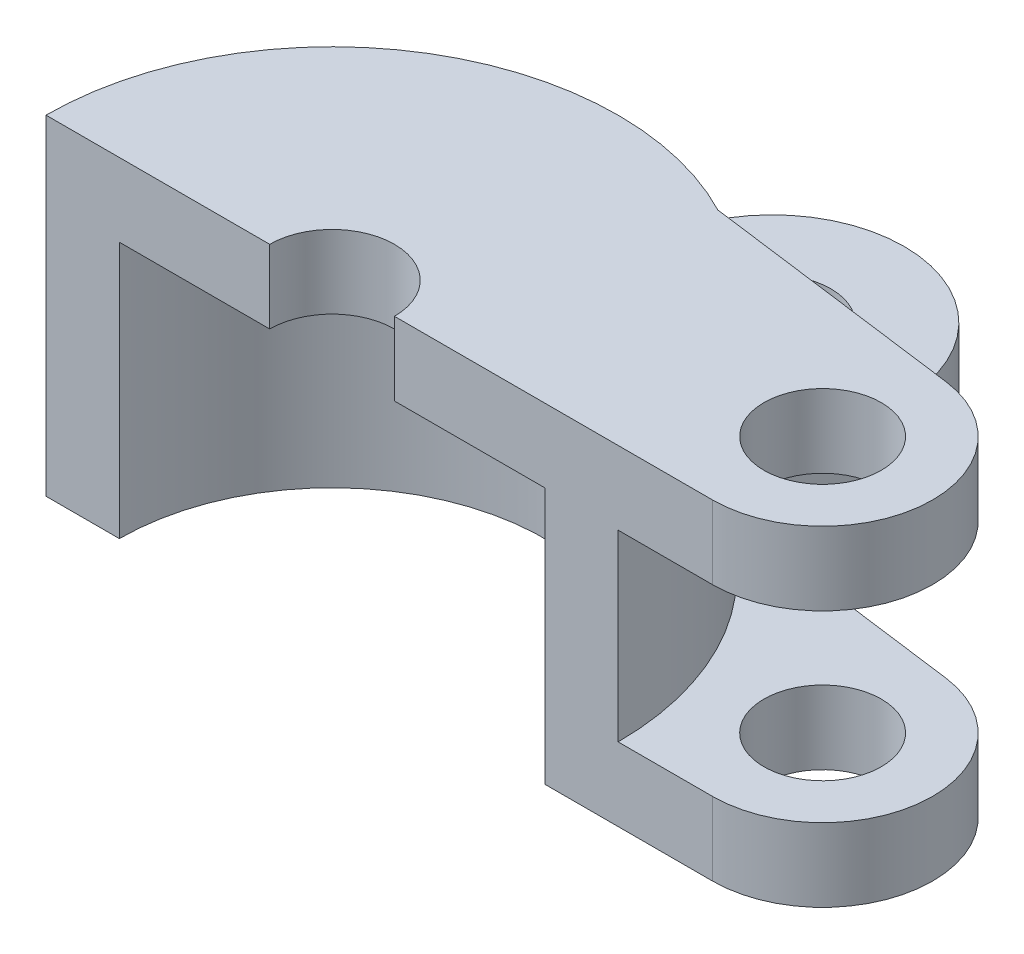
ISO-10303-21;
HEADER;
FILE_DESCRIPTION(('STEP AP214'),'2;1');
FILE_NAME('part.step','',(''),(''),'','','');
FILE_SCHEMA(('AUTOMOTIVE_DESIGN { 1 0 10303 214 1 1 1 1 }'));
ENDSEC;
DATA;
#1=APPLICATION_CONTEXT('core data for automotive mechanical design processes');
#2=APPLICATION_PROTOCOL_DEFINITION('international standard','automotive_design',2000,#1);
#3=PRODUCT_CONTEXT('',#1,'mechanical');
#4=PRODUCT('Part','Part','',(#3));
#5=PRODUCT_RELATED_PRODUCT_CATEGORY('part','',(#4));
#6=PRODUCT_DEFINITION_FORMATION('','',#4);
#7=PRODUCT_DEFINITION_CONTEXT('part definition',#1,'design');
#8=PRODUCT_DEFINITION('design','',#6,#7);
#9=PRODUCT_DEFINITION_SHAPE('','',#8);
#10=(LENGTH_UNIT() NAMED_UNIT(*) SI_UNIT(.MILLI.,.METRE.));
#11=(NAMED_UNIT(*) PLANE_ANGLE_UNIT() SI_UNIT($,.RADIAN.));
#12=(NAMED_UNIT(*) SI_UNIT($,.STERADIAN.) SOLID_ANGLE_UNIT());
#13=UNCERTAINTY_MEASURE_WITH_UNIT(LENGTH_MEASURE(1.E-05),#10,'distance_accuracy_value','');
#14=(GEOMETRIC_REPRESENTATION_CONTEXT(3) GLOBAL_UNCERTAINTY_ASSIGNED_CONTEXT((#13)) GLOBAL_UNIT_ASSIGNED_CONTEXT((#10,
#11,#12)) REPRESENTATION_CONTEXT('',''));
#15=CARTESIAN_POINT('',(0.,0.,0.));
#16=DIRECTION('',(0.,0.,1.));
#17=DIRECTION('',(1.,0.,0.));
#18=AXIS2_PLACEMENT_3D('',#15,#16,#17);
#19=CARTESIAN_POINT('',(10.3749698794743,20.9762279597806,-3.));
#20=DIRECTION('',(0.,-1.,0.));
#21=DIRECTION('',(0.,0.,-1.));
#22=AXIS2_PLACEMENT_3D('',#19,#20,#21);
#23=CYLINDRICAL_SURFACE('',#22,3.);
#24=DIRECTION('',(0.,-1.,0.));
#25=VECTOR('',#24,1.);
#26=CARTESIAN_POINT('',(10.3749698794743,20.9762279597806,0.));
#27=LINE('',#26,#25);
#28=CARTESIAN_POINT('',(10.3749698794743,9.,0.));
#29=VERTEX_POINT('',#28);
#30=CARTESIAN_POINT('',(10.3749698794743,7.,0.));
#31=VERTEX_POINT('',#30);
#32=EDGE_CURVE('E209',#29,#31,#27,.T.);
#33=ORIENTED_EDGE('',*,*,#32,.T.);
#34=CARTESIAN_POINT('',(10.3749698794743,7.,-3.));
#35=DIRECTION('',(0.,-1.,0.));
#36=DIRECTION('',(0.,0.,-1.));
#37=AXIS2_PLACEMENT_3D('',#34,#35,#36);
#38=CIRCLE('',#37,3.);
#39=CARTESIAN_POINT('',(10.7672455799969,7.,-5.97424272290941));
#40=VERTEX_POINT('',#39);
#41=EDGE_CURVE('E191',#40,#31,#38,.T.);
#42=ORIENTED_EDGE('',*,*,#41,.F.);
#43=DIRECTION('',(0.,-1.,0.));
#44=VECTOR('',#43,1.);
#45=CARTESIAN_POINT('',(10.7672455799969,20.9762279597806,-5.97424272290941));
#46=LINE('',#45,#44);
#47=CARTESIAN_POINT('',(10.7672455799969,9.,-5.97424272290941));
#48=VERTEX_POINT('',#47);
#49=EDGE_CURVE('E224',#48,#40,#46,.T.);
#50=ORIENTED_EDGE('',*,*,#49,.F.);
#51=CARTESIAN_POINT('',(10.3749698794743,9.,-3.));
#52=DIRECTION('',(0.,1.,0.));
#53=DIRECTION('',(0.,0.,1.));
#54=AXIS2_PLACEMENT_3D('',#51,#52,#53);
#55=CIRCLE('',#54,3.);
#56=EDGE_CURVE('E215',#48,#29,#55,.F.);
#57=ORIENTED_EDGE('',*,*,#56,.T.);
#58=EDGE_LOOP('',(#33,#42,#50,#57));
#59=FACE_BOUND('',#58,.T.);
#60=ADVANCED_FACE('F45',(#59),#23,.T.);
#61=CARTESIAN_POINT('',(3.6,20.9762279597806,-6.91953755680248));
#62=DIRECTION('',(0.130758566840845,0.,-0.991414240969802));
#63=DIRECTION('',(-0.991414240969802,0.,-0.130758566840845));
#64=AXIS2_PLACEMENT_3D('',#61,#62,#63);
#65=PLANE('',#64);
#66=ORIENTED_EDGE('',*,*,#49,.T.);
#67=DIRECTION('',(0.991414240969802,0.,0.130758566840845));
#68=VECTOR('',#67,1.);
#69=CARTESIAN_POINT('',(3.6,7.,-6.91953755680248));
#70=LINE('',#69,#68);
#71=CARTESIAN_POINT('',(3.6,6.99999999999983,-6.91953755680248));
#72=VERTEX_POINT('',#71);
#73=EDGE_CURVE('E198',#72,#40,#70,.T.);
#74=ORIENTED_EDGE('',*,*,#73,.F.);
#75=DIRECTION('',(0.,-1.,0.));
#76=VECTOR('',#75,1.);
#77=CARTESIAN_POINT('',(3.6,20.9762279597806,-6.91953755680248));
#78=LINE('',#77,#76);
#79=CARTESIAN_POINT('',(3.6,9.,-6.91953755680248));
#80=VERTEX_POINT('',#79);
#81=EDGE_CURVE('E227',#80,#72,#78,.T.);
#82=ORIENTED_EDGE('',*,*,#81,.F.);
#83=DIRECTION('',(0.991414240969802,0.,0.130758566840845));
#84=VECTOR('',#83,1.);
#85=CARTESIAN_POINT('',(3.6,9.,-6.91953755680248));
#86=LINE('',#85,#84);
#87=EDGE_CURVE('E216',#80,#48,#86,.T.);
#88=ORIENTED_EDGE('',*,*,#87,.T.);
#89=EDGE_LOOP('',(#66,#74,#82,#88));
#90=FACE_BOUND('',#89,.T.);
#91=ADVANCED_FACE('F404',(#90),#65,.T.);
#92=CARTESIAN_POINT('',(10.3749698794743,20.9762279597806,-3.));
#93=DIRECTION('',(0.,-1.,0.));
#94=DIRECTION('',(0.,0.,-1.));
#95=AXIS2_PLACEMENT_3D('',#92,#93,#94);
#96=CYLINDRICAL_SURFACE('',#95,1.6);
#97=CARTESIAN_POINT('',(10.3749698794743,9.,-3.));
#98=DIRECTION('',(0.,1.,0.));
#99=DIRECTION('',(0.,0.,1.));
#100=AXIS2_PLACEMENT_3D('',#97,#98,#99);
#101=CIRCLE('',#100,1.6);
#102=CARTESIAN_POINT('',(10.3749698794743,9.,-1.4));
#103=VERTEX_POINT('',#102);
#104=EDGE_CURVE('E234',#103,#103,#101,.F.);
#105=ORIENTED_EDGE('',*,*,#104,.F.);
#106=EDGE_LOOP('',(#105));
#107=FACE_BOUND('',#106,.T.);
#108=CARTESIAN_POINT('',(10.3749698794743,7.,-3.));
#109=DIRECTION('',(0.,-1.,0.));
#110=DIRECTION('',(0.,0.,-1.));
#111=AXIS2_PLACEMENT_3D('',#108,#109,#110);
#112=CIRCLE('',#111,1.6);
#113=CARTESIAN_POINT('',(10.3749698794743,7.,-4.6));
#114=VERTEX_POINT('',#113);
#115=EDGE_CURVE('E497',#114,#114,#112,.F.);
#116=ORIENTED_EDGE('',*,*,#115,.F.);
#117=EDGE_LOOP('',(#116));
#118=FACE_BOUND('',#117,.T.);
#119=ADVANCED_FACE('F396',(#107,#118),#96,.F.);
#120=CARTESIAN_POINT('',(0.,7.,0.));
#121=DIRECTION('',(0.,-1.,0.));
#122=DIRECTION('',(0.,0.,-1.));
#123=AXIS2_PLACEMENT_3D('',#120,#121,#122);
#124=CYLINDRICAL_SURFACE('',#123,7.8);
#125=CARTESIAN_POINT('',(0.,9.,0.));
#126=DIRECTION('',(0.,1.,0.));
#127=DIRECTION('',(0.,0.,1.));
#128=AXIS2_PLACEMENT_3D('',#125,#126,#127);
#129=CIRCLE('',#128,7.8);
#130=CARTESIAN_POINT('',(-7.8,9.,0.));
#131=VERTEX_POINT('',#130);
#132=EDGE_CURVE('E262',#80,#131,#129,.T.);
#133=ORIENTED_EDGE('',*,*,#132,.F.);
#134=ORIENTED_EDGE('',*,*,#81,.T.);
#135=CARTESIAN_POINT('',(0.,7.,0.));
#136=DIRECTION('',(0.,-1.,0.));
#137=DIRECTION('',(0.,0.,-1.));
#138=AXIS2_PLACEMENT_3D('',#135,#136,#137);
#139=CIRCLE('',#138,7.8);
#140=CARTESIAN_POINT('',(-3.6,7.,-6.91953755680248));
#141=VERTEX_POINT('',#140);
#142=EDGE_CURVE('E310',#72,#141,#139,.F.);
#143=ORIENTED_EDGE('',*,*,#142,.T.);
#144=DIRECTION('',(0.,-1.,0.));
#145=VECTOR('',#144,1.);
#146=CARTESIAN_POINT('',(-3.6,2.,-6.91953755680248));
#147=LINE('',#146,#145);
#148=CARTESIAN_POINT('',(-3.6,0.,-6.91953755680248));
#149=VERTEX_POINT('',#148);
#150=EDGE_CURVE('E253',#141,#149,#147,.T.);
#151=ORIENTED_EDGE('',*,*,#150,.T.);
#152=CARTESIAN_POINT('',(0.,0.,0.));
#153=DIRECTION('',(0.,1.,0.));
#154=DIRECTION('',(0.,0.,1.));
#155=AXIS2_PLACEMENT_3D('',#152,#153,#154);
#156=CIRCLE('',#155,7.8);
#157=CARTESIAN_POINT('',(-7.8,0.,0.));
#158=VERTEX_POINT('',#157);
#159=EDGE_CURVE('E282',#149,#158,#156,.T.);
#160=ORIENTED_EDGE('',*,*,#159,.T.);
#161=DIRECTION('',(0.,-1.,0.));
#162=VECTOR('',#161,1.);
#163=CARTESIAN_POINT('',(-7.8,7.,0.));
#164=LINE('',#163,#162);
#165=EDGE_CURVE('E302',#131,#158,#164,.T.);
#166=ORIENTED_EDGE('',*,*,#165,.F.);
#167=EDGE_LOOP('',(#133,#134,#143,#151,#160,#166));
#168=FACE_BOUND('',#167,.T.);
#169=ADVANCED_FACE('F339',(#168),#124,.T.);
#170=CARTESIAN_POINT('',(-7.8,7.,0.));
#171=DIRECTION('',(0.,0.,-1.));
#172=DIRECTION('',(-1.,0.,0.));
#173=AXIS2_PLACEMENT_3D('',#170,#171,#172);
#174=PLANE('',#173);
#175=DIRECTION('',(1.,0.,0.));
#176=VECTOR('',#175,1.);
#177=CARTESIAN_POINT('',(-7.8,0.,0.));
#178=LINE('',#177,#176);
#179=CARTESIAN_POINT('',(-5.8,0.,0.));
#180=VERTEX_POINT('',#179);
#181=EDGE_CURVE('E291',#158,#180,#178,.T.);
#182=ORIENTED_EDGE('',*,*,#181,.T.);
#183=DIRECTION('',(0.,-1.,0.));
#184=VECTOR('',#183,1.);
#185=CARTESIAN_POINT('',(-5.8,7.,0.));
#186=LINE('',#185,#184);
#187=CARTESIAN_POINT('',(-5.8,7.,0.));
#188=VERTEX_POINT('',#187);
#189=EDGE_CURVE('E299',#188,#180,#186,.T.);
#190=ORIENTED_EDGE('',*,*,#189,.F.);
#191=DIRECTION('',(1.,0.,0.));
#192=VECTOR('',#191,1.);
#193=CARTESIAN_POINT('',(-7.8,7.,0.));
#194=LINE('',#193,#192);
#195=CARTESIAN_POINT('',(-1.7,7.,0.));
#196=VERTEX_POINT('',#195);
#197=EDGE_CURVE('E256',#188,#196,#194,.T.);
#198=ORIENTED_EDGE('',*,*,#197,.T.);
#199=DIRECTION('',(0.,-1.,0.));
#200=VECTOR('',#199,1.);
#201=CARTESIAN_POINT('',(-1.7,9.,0.));
#202=LINE('',#201,#200);
#203=CARTESIAN_POINT('',(-1.7,9.,0.));
#204=VERTEX_POINT('',#203);
#205=EDGE_CURVE('E279',#204,#196,#202,.T.);
#206=ORIENTED_EDGE('',*,*,#205,.F.);
#207=DIRECTION('',(1.,0.,0.));
#208=VECTOR('',#207,1.);
#209=CARTESIAN_POINT('',(-7.8,9.,0.));
#210=LINE('',#209,#208);
#211=EDGE_CURVE('E264',#131,#204,#210,.T.);
#212=ORIENTED_EDGE('',*,*,#211,.F.);
#213=ORIENTED_EDGE('',*,*,#165,.T.);
#214=EDGE_LOOP('',(#182,#190,#198,#206,#212,#213));
#215=FACE_BOUND('',#214,.T.);
#216=ADVANCED_FACE('F476',(#215),#174,.F.);
#217=CARTESIAN_POINT('',(0.,7.,0.));
#218=DIRECTION('',(0.,-1.,0.));
#219=DIRECTION('',(0.,0.,-1.));
#220=AXIS2_PLACEMENT_3D('',#217,#218,#219);
#221=CYLINDRICAL_SURFACE('',#220,5.8);
#222=CARTESIAN_POINT('',(0.,0.,0.));
#223=DIRECTION('',(0.,-1.,0.));
#224=DIRECTION('',(0.,0.,1.));
#225=AXIS2_PLACEMENT_3D('',#222,#223,#224);
#226=CIRCLE('',#225,5.8);
#227=CARTESIAN_POINT('',(5.8,0.,0.));
#228=VERTEX_POINT('',#227);
#229=EDGE_CURVE('E293',#180,#228,#226,.T.);
#230=ORIENTED_EDGE('',*,*,#229,.T.);
#231=DIRECTION('',(0.,-1.,0.));
#232=VECTOR('',#231,1.);
#233=CARTESIAN_POINT('',(5.8,7.,0.));
#234=LINE('',#233,#232);
#235=CARTESIAN_POINT('',(5.8,7.,0.));
#236=VERTEX_POINT('',#235);
#237=EDGE_CURVE('E286',#236,#228,#234,.T.);
#238=ORIENTED_EDGE('',*,*,#237,.F.);
#239=CARTESIAN_POINT('',(0.,7.,0.));
#240=DIRECTION('',(0.,-1.,0.));
#241=DIRECTION('',(0.,0.,1.));
#242=AXIS2_PLACEMENT_3D('',#239,#240,#241);
#243=CIRCLE('',#242,5.8);
#244=EDGE_CURVE('E283',#188,#236,#243,.T.);
#245=ORIENTED_EDGE('',*,*,#244,.F.);
#246=ORIENTED_EDGE('',*,*,#189,.T.);
#247=EDGE_LOOP('',(#230,#238,#245,#246));
#248=FACE_BOUND('',#247,.T.);
#249=ADVANCED_FACE('F440',(#248),#221,.F.);
#250=CARTESIAN_POINT('',(5.8,7.,0.));
#251=DIRECTION('',(0.,0.,-1.));
#252=DIRECTION('',(-1.,0.,0.));
#253=AXIS2_PLACEMENT_3D('',#250,#251,#252);
#254=PLANE('',#253);
#255=CARTESIAN_POINT('',(10.3749698794743,2.,0.));
#256=VERTEX_POINT('',#255);
#257=CARTESIAN_POINT('',(10.3749698794743,0.,0.));
#258=VERTEX_POINT('',#257);
#259=EDGE_CURVE('E217',#256,#258,#27,.T.);
#260=ORIENTED_EDGE('',*,*,#259,.F.);
#261=DIRECTION('',(-1.,0.,0.));
#262=VECTOR('',#261,1.);
#263=CARTESIAN_POINT('',(10.3749698794743,2.,0.));
#264=LINE('',#263,#262);
#265=CARTESIAN_POINT('',(7.8,2.,0.));
#266=VERTEX_POINT('',#265);
#267=EDGE_CURVE('E505',#256,#266,#264,.T.);
#268=ORIENTED_EDGE('',*,*,#267,.T.);
#269=DIRECTION('',(0.,1.,0.));
#270=VECTOR('',#269,1.);
#271=CARTESIAN_POINT('',(7.8,2.,0.));
#272=LINE('',#271,#270);
#273=CARTESIAN_POINT('',(7.8,7.,0.));
#274=VERTEX_POINT('',#273);
#275=EDGE_CURVE('E212',#266,#274,#272,.T.);
#276=ORIENTED_EDGE('',*,*,#275,.T.);
#277=DIRECTION('',(-1.,0.,0.));
#278=VECTOR('',#277,1.);
#279=CARTESIAN_POINT('',(10.3749698794743,7.,0.));
#280=LINE('',#279,#278);
#281=EDGE_CURVE('E195',#31,#274,#280,.T.);
#282=ORIENTED_EDGE('',*,*,#281,.F.);
#283=ORIENTED_EDGE('',*,*,#32,.F.);
#284=DIRECTION('',(1.,0.,0.));
#285=VECTOR('',#284,1.);
#286=CARTESIAN_POINT('',(7.8,9.,0.));
#287=LINE('',#286,#285);
#288=CARTESIAN_POINT('',(1.7,9.,0.));
#289=VERTEX_POINT('',#288);
#290=EDGE_CURVE('E269',#289,#29,#287,.T.);
#291=ORIENTED_EDGE('',*,*,#290,.F.);
#292=DIRECTION('',(0.,-1.,0.));
#293=VECTOR('',#292,1.);
#294=CARTESIAN_POINT('',(1.7,9.,0.));
#295=LINE('',#294,#293);
#296=CARTESIAN_POINT('',(1.7,7.,0.));
#297=VERTEX_POINT('',#296);
#298=EDGE_CURVE('E271',#289,#297,#295,.T.);
#299=ORIENTED_EDGE('',*,*,#298,.T.);
#300=DIRECTION('',(1.,0.,0.));
#301=VECTOR('',#300,1.);
#302=CARTESIAN_POINT('',(7.8,7.,0.));
#303=LINE('',#302,#301);
#304=EDGE_CURVE('E265',#297,#236,#303,.T.);
#305=ORIENTED_EDGE('',*,*,#304,.T.);
#306=ORIENTED_EDGE('',*,*,#237,.T.);
#307=DIRECTION('',(1.,0.,0.));
#308=VECTOR('',#307,1.);
#309=CARTESIAN_POINT('',(5.8,0.,0.));
#310=LINE('',#309,#308);
#311=EDGE_CURVE('E287',#228,#258,#310,.T.);
#312=ORIENTED_EDGE('',*,*,#311,.T.);
#313=EDGE_LOOP('',(#260,#268,#276,#282,#283,#291,#299,#305,#306,#312));
#314=FACE_BOUND('',#313,.T.);
#315=ADVANCED_FACE('F207',(#314),#254,.F.);
#316=CARTESIAN_POINT('',(0.,0.,0.));
#317=DIRECTION('',(0.,1.,0.));
#318=DIRECTION('',(0.,0.,1.));
#319=AXIS2_PLACEMENT_3D('',#316,#317,#318);
#320=PLANE('',#319);
#321=DIRECTION('',(0.,0.,-1.));
#322=VECTOR('',#321,1.);
#323=CARTESIAN_POINT('',(3.6,0.,0.));
#324=LINE('',#323,#322);
#325=CARTESIAN_POINT('',(3.6,0.,-6.91953755680248));
#326=VERTEX_POINT('',#325);
#327=CARTESIAN_POINT('',(3.6,0.,-10.7833204533669));
#328=VERTEX_POINT('',#327);
#329=EDGE_CURVE('E522',#326,#328,#324,.T.);
#330=ORIENTED_EDGE('',*,*,#329,.F.);
#331=DIRECTION('',(0.991414240969802,0.,0.130758566840845));
#332=VECTOR('',#331,1.);
#333=CARTESIAN_POINT('',(3.6,0.,-6.91953755680248));
#334=LINE('',#333,#332);
#335=CARTESIAN_POINT('',(10.7672455799969,0.,-5.97424272290941));
#336=VERTEX_POINT('',#335);
#337=EDGE_CURVE('E451',#326,#336,#334,.T.);
#338=ORIENTED_EDGE('',*,*,#337,.T.);
#339=CARTESIAN_POINT('',(10.3749698794743,0.,-3.));
#340=DIRECTION('',(0.,-1.,0.));
#341=DIRECTION('',(0.,0.,-1.));
#342=AXIS2_PLACEMENT_3D('',#339,#340,#341);
#343=CIRCLE('',#342,3.);
#344=EDGE_CURVE('E450',#336,#258,#343,.T.);
#345=ORIENTED_EDGE('',*,*,#344,.T.);
#346=ORIENTED_EDGE('',*,*,#311,.F.);
#347=ORIENTED_EDGE('',*,*,#229,.F.);
#348=ORIENTED_EDGE('',*,*,#181,.F.);
#349=ORIENTED_EDGE('',*,*,#159,.F.);
#350=DIRECTION('',(0.,0.,1.));
#351=VECTOR('',#350,1.);
#352=CARTESIAN_POINT('',(-3.6,0.,0.));
#353=LINE('',#352,#351);
#354=CARTESIAN_POINT('',(-3.6,0.,-10.7833204533669));
#355=VERTEX_POINT('',#354);
#356=EDGE_CURVE('E69',#355,#149,#353,.T.);
#357=ORIENTED_EDGE('',*,*,#356,.F.);
#358=CARTESIAN_POINT('',(-0.600000000000001,0.,-10.7833204533669));
#359=DIRECTION('',(0.,1.,0.));
#360=DIRECTION('',(0.,0.,1.));
#361=AXIS2_PLACEMENT_3D('',#358,#359,#360);
#362=CIRCLE('',#361,3.);
#363=CARTESIAN_POINT('',(-0.433333333333334,0.,-7.78795366076495));
#364=VERTEX_POINT('',#363);
#365=EDGE_CURVE('E11',#355,#364,#362,.T.);
#366=ORIENTED_EDGE('',*,*,#365,.T.);
#367=CARTESIAN_POINT('',(0.433333333333334,0.,-7.78795366076495));
#368=VERTEX_POINT('',#367);
#369=EDGE_CURVE('E288',#368,#364,#156,.T.);
#370=ORIENTED_EDGE('',*,*,#369,.F.);
#371=CARTESIAN_POINT('',(0.600000000000001,0.,-10.7833204533669));
#372=DIRECTION('',(0.,1.,0.));
#373=DIRECTION('',(0.,0.,1.));
#374=AXIS2_PLACEMENT_3D('',#371,#372,#373);
#375=CIRCLE('',#374,3.);
#376=EDGE_CURVE('E54',#368,#328,#375,.T.);
#377=ORIENTED_EDGE('',*,*,#376,.T.);
#378=EDGE_LOOP('',(#330,#338,#345,#346,#347,#348,#349,#357,#366,#370,#377));
#379=FACE_BOUND('',#378,.T.);
#380=CARTESIAN_POINT('',(10.3749698794743,0.,-3.));
#381=DIRECTION('',(0.,-1.,0.));
#382=DIRECTION('',(0.,0.,-1.));
#383=AXIS2_PLACEMENT_3D('',#380,#381,#382);
#384=CIRCLE('',#383,1.6);
#385=CARTESIAN_POINT('',(10.3749698794743,0.,-4.6));
#386=VERTEX_POINT('',#385);
#387=EDGE_CURVE('E226',#386,#386,#384,.T.);
#388=ORIENTED_EDGE('',*,*,#387,.F.);
#389=EDGE_LOOP('',(#388));
#390=FACE_BOUND('',#389,.T.);
#391=ADVANCED_FACE('F445',(#379,#390),#320,.F.);
#392=CARTESIAN_POINT('',(0.,7.,0.));
#393=DIRECTION('',(0.,1.,0.));
#394=DIRECTION('',(0.,0.,1.));
#395=AXIS2_PLACEMENT_3D('',#392,#393,#394);
#396=PLANE('',#395);
#397=ORIENTED_EDGE('',*,*,#197,.F.);
#398=ORIENTED_EDGE('',*,*,#244,.T.);
#399=ORIENTED_EDGE('',*,*,#304,.F.);
#400=CARTESIAN_POINT('',(0.,7.,0.));
#401=DIRECTION('',(0.,-1.,0.));
#402=DIRECTION('',(0.,0.,1.));
#403=AXIS2_PLACEMENT_3D('',#400,#401,#402);
#404=CIRCLE('',#403,1.7);
#405=EDGE_CURVE('E273',#196,#297,#404,.T.);
#406=ORIENTED_EDGE('',*,*,#405,.F.);
#407=EDGE_LOOP('',(#397,#398,#399,#406));
#408=FACE_BOUND('',#407,.T.);
#409=ADVANCED_FACE('F437',(#408),#396,.F.);
#410=CARTESIAN_POINT('',(0.,9.,0.));
#411=DIRECTION('',(0.,-1.,0.));
#412=DIRECTION('',(0.,0.,-1.));
#413=AXIS2_PLACEMENT_3D('',#410,#411,#412);
#414=CYLINDRICAL_SURFACE('',#413,1.7);
#415=ORIENTED_EDGE('',*,*,#405,.T.);
#416=ORIENTED_EDGE('',*,*,#298,.F.);
#417=CARTESIAN_POINT('',(0.,9.,0.));
#418=DIRECTION('',(0.,-1.,0.));
#419=DIRECTION('',(0.,0.,1.));
#420=AXIS2_PLACEMENT_3D('',#417,#418,#419);
#421=CIRCLE('',#420,1.7);
#422=EDGE_CURVE('E267',#204,#289,#421,.T.);
#423=ORIENTED_EDGE('',*,*,#422,.F.);
#424=ORIENTED_EDGE('',*,*,#205,.T.);
#425=EDGE_LOOP('',(#415,#416,#423,#424));
#426=FACE_BOUND('',#425,.T.);
#427=ADVANCED_FACE('F469',(#426),#414,.F.);
#428=CARTESIAN_POINT('',(0.,9.,0.));
#429=DIRECTION('',(0.,1.,0.));
#430=DIRECTION('',(0.,0.,1.));
#431=AXIS2_PLACEMENT_3D('',#428,#429,#430);
#432=PLANE('',#431);
#433=ORIENTED_EDGE('',*,*,#290,.T.);
#434=ORIENTED_EDGE('',*,*,#56,.F.);
#435=ORIENTED_EDGE('',*,*,#87,.F.);
#436=ORIENTED_EDGE('',*,*,#132,.T.);
#437=ORIENTED_EDGE('',*,*,#211,.T.);
#438=ORIENTED_EDGE('',*,*,#422,.T.);
#439=EDGE_LOOP('',(#433,#434,#435,#436,#437,#438));
#440=FACE_BOUND('',#439,.T.);
#441=ORIENTED_EDGE('',*,*,#104,.T.);
#442=EDGE_LOOP('',(#441));
#443=FACE_BOUND('',#442,.T.);
#444=ADVANCED_FACE('F382',(#440,#443),#432,.T.);
#445=CARTESIAN_POINT('',(0.,2.,0.));
#446=DIRECTION('',(0.,-1.,0.));
#447=DIRECTION('',(0.,0.,-1.));
#448=AXIS2_PLACEMENT_3D('',#445,#446,#447);
#449=CYLINDRICAL_SURFACE('',#448,7.8);
#450=CARTESIAN_POINT('',(0.,-1.5,0.));
#451=DIRECTION('',(0.,-1.,0.));
#452=DIRECTION('',(0.,0.,-1.));
#453=AXIS2_PLACEMENT_3D('',#450,#451,#452);
#454=CIRCLE('',#453,7.8);
#455=CARTESIAN_POINT('',(-0.433333333333334,-1.5,-7.78795366076495));
#456=VERTEX_POINT('',#455);
#457=CARTESIAN_POINT('',(0.433333333333334,-1.5,-7.78795366076495));
#458=VERTEX_POINT('',#457);
#459=EDGE_CURVE('E243',#456,#458,#454,.T.);
#460=ORIENTED_EDGE('',*,*,#459,.T.);
#461=DIRECTION('',(0.,-1.,0.));
#462=VECTOR('',#461,1.);
#463=CARTESIAN_POINT('',(0.433333333333334,2.,-7.78795366076495));
#464=LINE('',#463,#462);
#465=EDGE_CURVE('E490',#458,#368,#464,.F.);
#466=ORIENTED_EDGE('',*,*,#465,.T.);
#467=ORIENTED_EDGE('',*,*,#369,.T.);
#468=DIRECTION('',(0.,-1.,0.));
#469=VECTOR('',#468,1.);
#470=CARTESIAN_POINT('',(-0.433333333333334,2.,-7.78795366076495));
#471=LINE('',#470,#469);
#472=EDGE_CURVE('E493',#364,#456,#471,.T.);
#473=ORIENTED_EDGE('',*,*,#472,.T.);
#474=EDGE_LOOP('',(#460,#466,#467,#473));
#475=FACE_BOUND('',#474,.T.);
#476=ADVANCED_FACE('F369',(#475),#449,.F.);
#477=CARTESIAN_POINT('',(-3.6,2.,0.));
#478=DIRECTION('',(1.,0.,0.));
#479=DIRECTION('',(0.,0.,-1.));
#480=AXIS2_PLACEMENT_3D('',#477,#478,#479);
#481=PLANE('',#480);
#482=DIRECTION('',(0.,0.,1.));
#483=VECTOR('',#482,1.);
#484=CARTESIAN_POINT('',(-3.6,-1.5,0.));
#485=LINE('',#484,#483);
#486=CARTESIAN_POINT('',(-3.6,-1.5,-12.));
#487=VERTEX_POINT('',#486);
#488=CARTESIAN_POINT('',(-3.6,-1.5,-10.7833204533669));
#489=VERTEX_POINT('',#488);
#490=EDGE_CURVE('E233',#487,#489,#485,.T.);
#491=ORIENTED_EDGE('',*,*,#490,.T.);
#492=DIRECTION('',(0.,-1.,0.));
#493=VECTOR('',#492,1.);
#494=CARTESIAN_POINT('',(-3.6,2.,-10.7833204533669));
#495=LINE('',#494,#493);
#496=EDGE_CURVE('E488',#489,#355,#495,.F.);
#497=ORIENTED_EDGE('',*,*,#496,.T.);
#498=ORIENTED_EDGE('',*,*,#356,.T.);
#499=ORIENTED_EDGE('',*,*,#150,.F.);
#500=CARTESIAN_POINT('',(-3.6,7.,-6.91953755680248));
#501=CARTESIAN_POINT('',(-3.6,6.8687690737443,-6.91950567284725));
#502=CARTESIAN_POINT('',(-3.6,6.73755083888044,-6.92536013367552));
#503=CARTESIAN_POINT('',(-3.6,6.47619392966398,-6.9486025719701));
#504=CARTESIAN_POINT('',(-3.6,6.34605482017702,-6.96598564636697));
#505=CARTESIAN_POINT('',(-3.6,6.08837602610761,-7.01194325735084));
#506=CARTESIAN_POINT('',(-3.6,5.9608273031768,-7.04046726874671));
#507=CARTESIAN_POINT('',(-3.6,5.70862488393409,-7.1082846052358));
#508=CARTESIAN_POINT('',(-3.6,5.58397139081613,-7.1475786837348));
#509=CARTESIAN_POINT('',(-3.6,5.33857007548336,-7.23634733064854));
#510=CARTESIAN_POINT('',(-3.6,5.21781632447883,-7.28580551312741));
#511=CARTESIAN_POINT('',(-3.6,4.98069770888505,-7.39434728196256));
#512=CARTESIAN_POINT('',(-3.6,4.86433452273349,-7.45343450433043));
#513=CARTESIAN_POINT('',(-3.6,4.52266965884873,-7.64429225401439));
#514=CARTESIAN_POINT('',(-3.6,4.30480313384272,-7.78965502049812));
#515=CARTESIAN_POINT('',(-3.6,3.88079339380374,-8.12117773129626));
#516=CARTESIAN_POINT('',(-3.6,3.67619545794688,-8.30929706431297));
#517=CARTESIAN_POINT('',(-3.6,3.29809893788453,-8.71459933684407));
#518=CARTESIAN_POINT('',(-3.6,3.12461194985302,-8.93179306097124));
#519=CARTESIAN_POINT('',(-3.6,2.79746497338993,-9.41099804964583));
#520=CARTESIAN_POINT('',(-3.6,2.64715497810478,-9.67529930875993));
#521=CARTESIAN_POINT('',(-3.6,2.39136179962235,-10.2246866224576));
#522=CARTESIAN_POINT('',(-3.6,2.28585697500154,-10.5097625644886));
#523=CARTESIAN_POINT('',(-3.6,2.14953991359685,-10.9968852613042));
#524=CARTESIAN_POINT('',(-3.6,2.10557145204241,-11.1953454023165));
#525=CARTESIAN_POINT('',(-3.6,2.03977485747129,-11.59564100806));
#526=CARTESIAN_POINT('',(-3.6,2.01791887360574,-11.797471900614));
#527=CARTESIAN_POINT('',(-3.6,2.00738385676086,-12.));
#528=B_SPLINE_CURVE_WITH_KNOTS('',3,(#500,#501,#502,#503,#504,#505,#506,#507,#508,#509,#510,
#511,#512,#513,#514,#515,#516,#517,#518,#519,#520,#521,#522,#523,#524,#525,#526,#527),
.UNSPECIFIED.,.F.,.F.,(4,2,2,2,2,2,2,2,2,2,2,2,2,4),(0.,0.393542290880505,0.786917317166907,
1.17852868674321,1.57016745796882,1.96117973791321,2.35234001118146,3.13469360207407,
3.96516742120394,4.79595014741847,5.70408483200675,6.61178037660279,7.22044250281973,
7.82833705609297),.UNSPECIFIED.);
#529=CARTESIAN_POINT('',(-3.6,2.00738385676086,-12.));
#530=VERTEX_POINT('',#529);
#531=EDGE_CURVE('E353',#141,#530,#528,.T.);
#532=ORIENTED_EDGE('',*,*,#531,.T.);
#533=DIRECTION('',(0.,-1.,0.));
#534=VECTOR('',#533,1.);
#535=CARTESIAN_POINT('',(-3.6,2.,-12.));
#536=LINE('',#535,#534);
#537=EDGE_CURVE('E252',#530,#487,#536,.T.);
#538=ORIENTED_EDGE('',*,*,#537,.T.);
#539=EDGE_LOOP('',(#491,#497,#498,#499,#532,#538));
#540=FACE_BOUND('',#539,.T.);
#541=ADVANCED_FACE('F365',(#540),#481,.F.);
#542=CARTESIAN_POINT('',(3.6,2.,0.));
#543=DIRECTION('',(1.,0.,0.));
#544=DIRECTION('',(0.,0.,-1.));
#545=AXIS2_PLACEMENT_3D('',#542,#543,#544);
#546=PLANE('',#545);
#547=ORIENTED_EDGE('',*,*,#329,.T.);
#548=DIRECTION('',(0.,1.,0.));
#549=VECTOR('',#548,1.);
#550=CARTESIAN_POINT('',(3.6,-1.5,-10.7833204533669));
#551=LINE('',#550,#549);
#552=CARTESIAN_POINT('',(3.6,-1.5,-10.7833204533669));
#553=VERTEX_POINT('',#552);
#554=EDGE_CURVE('E523',#328,#553,#551,.F.);
#555=ORIENTED_EDGE('',*,*,#554,.T.);
#556=DIRECTION('',(0.,0.,1.));
#557=VECTOR('',#556,1.);
#558=CARTESIAN_POINT('',(3.6,-1.5,0.));
#559=LINE('',#558,#557);
#560=CARTESIAN_POINT('',(3.6,-1.5,-12.));
#561=VERTEX_POINT('',#560);
#562=EDGE_CURVE('E240',#561,#553,#559,.T.);
#563=ORIENTED_EDGE('',*,*,#562,.F.);
#564=DIRECTION('',(0.,-1.,0.));
#565=VECTOR('',#564,1.);
#566=CARTESIAN_POINT('',(3.6,2.,-12.));
#567=LINE('',#566,#565);
#568=CARTESIAN_POINT('',(3.6,2.00738385676086,-12.));
#569=VERTEX_POINT('',#568);
#570=EDGE_CURVE('E259',#569,#561,#567,.T.);
#571=ORIENTED_EDGE('',*,*,#570,.F.);
#572=CARTESIAN_POINT('',(3.6,2.00738385676086,-12.));
#573=CARTESIAN_POINT('',(3.6,2.01549098341776,-11.8441661493082));
#574=CARTESIAN_POINT('',(3.6,2.030306365497,-11.6886935795519));
#575=CARTESIAN_POINT('',(3.6,2.07307522878406,-11.3795886551856));
#576=CARTESIAN_POINT('',(3.6,2.10102669774833,-11.2259560224212));
#577=CARTESIAN_POINT('',(3.6,2.16976875678274,-10.9217029917411));
#578=CARTESIAN_POINT('',(3.6,2.21055066403767,-10.7710806297657));
#579=CARTESIAN_POINT('',(3.6,2.3046027710494,-10.4737840400305));
#580=CARTESIAN_POINT('',(3.6,2.35787327368715,-10.3271099081219));
#581=CARTESIAN_POINT('',(3.6,2.47648327099278,-10.0387614424123));
#582=CARTESIAN_POINT('',(3.6,2.54182027889337,-9.89708608557398));
#583=CARTESIAN_POINT('',(3.6,2.68414138286701,-9.61964888576215));
#584=CARTESIAN_POINT('',(3.6,2.76112948257133,-9.48388909627126));
#585=CARTESIAN_POINT('',(3.6,2.92624213888515,-9.21931572296553));
#586=CARTESIAN_POINT('',(3.6,3.01436675770138,-9.09050217795698));
#587=CARTESIAN_POINT('',(3.6,3.20121474144541,-8.84080747118913));
#588=CARTESIAN_POINT('',(3.6,3.29993776131201,-8.71992605138318));
#589=CARTESIAN_POINT('',(3.6,3.5075847020557,-8.48688612126945));
#590=CARTESIAN_POINT('',(3.6,3.61652580559549,-8.37474290635712));
#591=CARTESIAN_POINT('',(3.6,3.84377969211313,-8.16048209644511));
#592=CARTESIAN_POINT('',(3.6,3.96208840512935,-8.05836019018905));
#593=CARTESIAN_POINT('',(3.6,4.20748428330544,-7.86508399950196));
#594=CARTESIAN_POINT('',(3.6,4.33457700647717,-7.77393676107768));
#595=CARTESIAN_POINT('',(3.6,4.59658757137503,-7.60382187745229));
#596=CARTESIAN_POINT('',(3.6,4.73150104617217,-7.52484752363867));
#597=CARTESIAN_POINT('',(3.6,5.00003805568904,-7.38441334676096));
#598=CARTESIAN_POINT('',(3.6,5.13326351007367,-7.32219254043109));
#599=CARTESIAN_POINT('',(3.6,5.40483579191246,-7.21035962129148));
#600=CARTESIAN_POINT('',(3.6,5.54317970871157,-7.16074046496887));
#601=CARTESIAN_POINT('',(3.6,5.82365509071613,-7.07496040644152));
#602=CARTESIAN_POINT('',(3.6,5.96577770332935,-7.0387705873123));
#603=CARTESIAN_POINT('',(3.6,6.25279334058853,-6.9803642318504));
#604=CARTESIAN_POINT('',(3.6,6.39768429351423,-6.95813763785315));
#605=CARTESIAN_POINT('',(3.6,6.61917931709081,-6.93524839140377));
#606=CARTESIAN_POINT('',(3.6,6.6952755365583,-6.9293564085573));
#607=CARTESIAN_POINT('',(3.6,6.84757707030837,-6.92150257113929));
#608=CARTESIAN_POINT('',(3.6,6.92378213725713,-6.91953591761962));
#609=CARTESIAN_POINT('',(3.6,7.,-6.91953755680248));
#610=B_SPLINE_CURVE_WITH_KNOTS('',3,(#572,#573,#574,#575,#576,#577,#578,#579,#580,#581,#582,
#583,#584,#585,#586,#587,#588,#589,#590,#591,#592,#593,#594,#595,#596,#597,#598,#599,#600,#601,
#602,#603,#604,#605,#606,#607,#608,#609),.UNSPECIFIED.,.F.,.F.,(4,2,2,2,2,2,2,2,2,2,2,2,2,2,2,2,
2,2,4),(0.,0.467973049661953,0.935874436508843,1.40345985645214,1.87105661773278,
2.33855712004423,2.80621863451764,3.27388276138508,3.74153166672659,4.20998156972218,
4.67822904964964,5.14677557086076,5.61506294041774,6.05557603410509,6.49584236468377,
6.93515510707712,7.37415105005329,7.60303401391561,7.83163698294957),.UNSPECIFIED.);
#611=EDGE_CURVE('E346',#569,#72,#610,.T.);
#612=ORIENTED_EDGE('',*,*,#611,.T.);
#613=DIRECTION('',(0.,-1.,0.));
#614=VECTOR('',#613,1.);
#615=CARTESIAN_POINT('',(3.6,2.,-6.91953755680248));
#616=LINE('',#615,#614);
#617=CARTESIAN_POINT('',(3.6,2.,-6.91953755680248));
#618=VERTEX_POINT('',#617);
#619=EDGE_CURVE('E257',#72,#618,#616,.T.);
#620=ORIENTED_EDGE('',*,*,#619,.T.);
#621=EDGE_CURVE('E62',#618,#326,#616,.T.);
#622=ORIENTED_EDGE('',*,*,#621,.T.);
#623=EDGE_LOOP('',(#547,#555,#563,#571,#612,#620,#622));
#624=FACE_BOUND('',#623,.T.);
#625=ADVANCED_FACE('F368',(#624),#546,.T.);
#626=CARTESIAN_POINT('',(0.,2.,-12.));
#627=DIRECTION('',(0.,-1.,0.));
#628=DIRECTION('',(0.,0.,-1.));
#629=AXIS2_PLACEMENT_3D('',#626,#627,#628);
#630=CYLINDRICAL_SURFACE('',#629,1.6);
#631=CARTESIAN_POINT('',(0.,2.,-12.));
#632=DIRECTION('',(0.,-1.,0.));
#633=DIRECTION('',(0.,0.,-1.));
#634=AXIS2_PLACEMENT_3D('',#631,#632,#633);
#635=CIRCLE('',#634,1.6);
#636=CARTESIAN_POINT('',(-1.42884568795934,2.,-12.72));
#637=VERTEX_POINT('',#636);
#638=CARTESIAN_POINT('',(1.42884568795934,2.,-12.72));
#639=VERTEX_POINT('',#638);
#640=EDGE_CURVE('E246',#637,#639,#635,.T.);
#641=ORIENTED_EDGE('',*,*,#640,.F.);
#642=CARTESIAN_POINT('',(-1.42884568795934,2.,-12.72));
#643=CARTESIAN_POINT('',(-1.44839499670953,1.99999932876585,-12.6812048151067));
#644=CARTESIAN_POINT('',(-1.46635411809262,2.00039740488078,-12.6416296134959));
#645=CARTESIAN_POINT('',(-1.49899243071172,2.00209722221955,-12.56116706325));
#646=CARTESIAN_POINT('',(-1.51367153856851,2.00339898641203,-12.520279681289));
#647=CARTESIAN_POINT('',(-1.55258006176748,2.00881097179904,-12.396209300182));
#648=CARTESIAN_POINT('',(-1.57176893369431,2.01442694366375,-12.3114423932851));
#649=CARTESIAN_POINT('',(-1.59618369408897,2.03021886820681,-12.1403055143952));
#650=CARTESIAN_POINT('',(-1.60139742823823,2.04039878121657,-12.0539342127277));
#651=CARTESIAN_POINT('',(-1.59796466545536,2.06543437050239,-11.8821736974492));
#652=CARTESIAN_POINT('',(-1.58932144703412,2.0802889401013,-11.796784256347));
#653=CARTESIAN_POINT('',(-1.55875168688479,2.11438420460334,-11.6290767076602));
#654=CARTESIAN_POINT('',(-1.53678577939251,2.13363779219358,-11.5467684725882));
#655=CARTESIAN_POINT('',(-1.48051651260511,2.17573560537996,-11.3874515856647));
#656=CARTESIAN_POINT('',(-1.44620768602295,2.19858141962183,-11.3104453003449));
#657=CARTESIAN_POINT('',(-1.36415454996407,2.24806846218342,-11.1592325079751));
#658=CARTESIAN_POINT('',(-1.31576832160064,2.2748502168439,-11.0854208660552));
#659=CARTESIAN_POINT('',(-1.20778293573209,2.32946482813826,-10.9469183245721));
#660=CARTESIAN_POINT('',(-1.14817746516632,2.35729826947338,-10.8822325961831));
#661=CARTESIAN_POINT('',(-1.01463089303424,2.41380487023197,-10.7593158009502));
#662=CARTESIAN_POINT('',(-0.940000601638004,2.44241102497895,-10.7017987596611));
#663=CARTESIAN_POINT('',(-0.780747251318977,2.49562959207625,-10.6002340743626));
#664=CARTESIAN_POINT('',(-0.696125580742618,2.52024255817207,-10.5561845620265));
#665=CARTESIAN_POINT('',(-0.522145655399368,2.56149735704212,-10.4847904374865));
#666=CARTESIAN_POINT('',(-0.433087517280683,2.57840542007153,-10.4568771240638));
#667=CARTESIAN_POINT('',(-0.250300644787328,2.6029302178305,-10.41694617919));
#668=CARTESIAN_POINT('',(-0.15658040050853,2.61056324177253,-10.4049006768844));
#669=CARTESIAN_POINT('',(0.0179578720427469,2.61487417755222,-10.3980744466211));
#670=CARTESIAN_POINT('',(0.0986603675873094,2.61298974384755,-10.4010283841923));
#671=CARTESIAN_POINT('',(0.258194557305134,2.6017701906909,-10.4189315905955));
#672=CARTESIAN_POINT('',(0.337025913640034,2.59243373613975,-10.4338830088908));
#673=CARTESIAN_POINT('',(0.487627278369277,2.56798523193776,-10.4741991694583));
#674=CARTESIAN_POINT('',(0.559552544849467,2.5531110131161,-10.4991379320302));
#675=CARTESIAN_POINT('',(0.698294960367035,2.51906558011962,-10.5584447527879));
#676=CARTESIAN_POINT('',(0.765110475590317,2.49989299920803,-10.5928158109119));
#677=CARTESIAN_POINT('',(0.900580933575962,2.45626232966383,-10.6748669749787));
#678=CARTESIAN_POINT('',(0.968440407457927,2.43144377392682,-10.7236676761915));
#679=CARTESIAN_POINT('',(1.09549417700689,2.380391258768,-10.8308928868294));
#680=CARTESIAN_POINT('',(1.15468289320294,2.35415640271104,-10.8893235420157));
#681=CARTESIAN_POINT('',(1.26983480509837,2.29898807936069,-11.0221820427256));
#682=CARTESIAN_POINT('',(1.32458934936512,2.27010226230935,-11.0976844651329));
#683=CARTESIAN_POINT('',(1.42049064166401,2.21494718250435,-11.2577682279092));
#684=CARTESIAN_POINT('',(1.46163789187254,2.18867782321547,-11.3423492330811));
#685=CARTESIAN_POINT('',(1.52849951870257,2.14060611453729,-11.5178793824766));
#686=CARTESIAN_POINT('',(1.55432365854722,2.11877274972861,-11.608777892608));
#687=CARTESIAN_POINT('',(1.58960353372914,2.0804611074706,-11.794797912024));
#688=CARTESIAN_POINT('',(1.59906522598077,2.06398088293186,-11.8899178715063));
#689=CARTESIAN_POINT('',(1.60074054103329,2.03781362070102,-12.0741726888251));
#690=CARTESIAN_POINT('',(1.59415530333162,2.02772059367525,-12.163241301635));
#691=CARTESIAN_POINT('',(1.56612301644579,2.01235771461035,-12.3393927491095));
#692=CARTESIAN_POINT('',(1.54469302851072,2.00708234170379,-12.4264777450111));
#693=CARTESIAN_POINT('',(1.50408982100682,2.00254740842123,-12.5469469348578));
#694=CARTESIAN_POINT('',(1.49074648897687,2.0015730405172,-12.5823288291075));
#695=CARTESIAN_POINT('',(1.46161375836567,2.00030017235502,-12.6520005390814));
#696=CARTESIAN_POINT('',(1.44582930212513,2.00000032511016,-12.686292396231));
#697=CARTESIAN_POINT('',(1.42884568795939,1.99999999999996,-12.72));
#698=B_SPLINE_CURVE_WITH_KNOTS('',3,(#642,#643,#644,#645,#646,#647,#648,#649,#650,#651,#652,
#653,#654,#655,#656,#657,#658,#659,#660,#661,#662,#663,#664,#665,#666,#667,#668,#669,#670,#671,
#672,#673,#674,#675,#676,#677,#678,#679,#680,#681,#682,#683,#684,#685,#686,#687,#688,#689,#690,
#691,#692,#693,#694,#695,#696,#697),.UNSPECIFIED.,.F.,.F.,(4,2,2,2,2,2,2,2,2,2,2,2,2,2,2,2,2,2,
2,2,2,2,2,2,2,2,2,4),(0.,0.130250433252559,0.260504177145424,0.520429371727478,
0.780580552641244,1.0406701916964,1.30153211093309,1.56250972132315,1.83802392797184,
2.11369363228914,2.40767218827941,2.70160994261464,2.98443254874162,3.26675772869677,
3.5078338706,3.74895321324467,3.98072891242355,4.21257841338422,4.47311741379454,
4.73382333663621,5.02535159069107,5.31686908471199,5.60627233628549,5.89557020548343,
6.16388691828522,6.43189576202062,6.545294770114,6.65846712381961),.UNSPECIFIED.);
#699=EDGE_CURVE('E313',#637,#639,#698,.T.);
#700=ORIENTED_EDGE('',*,*,#699,.T.);
#701=EDGE_LOOP('',(#641,#700));
#702=FACE_BOUND('',#701,.T.);
#703=CARTESIAN_POINT('',(0.,-1.5,-12.));
#704=DIRECTION('',(0.,-1.,0.));
#705=DIRECTION('',(0.,0.,-1.));
#706=AXIS2_PLACEMENT_3D('',#703,#704,#705);
#707=CIRCLE('',#706,1.6);
#708=CARTESIAN_POINT('',(0.,-1.5,-13.6));
#709=VERTEX_POINT('',#708);
#710=EDGE_CURVE('E230',#709,#709,#707,.T.);
#711=ORIENTED_EDGE('',*,*,#710,.T.);
#712=EDGE_LOOP('',(#711));
#713=FACE_BOUND('',#712,.T.);
#714=ADVANCED_FACE('F328',(#702,#713),#630,.F.);
#715=CARTESIAN_POINT('',(0.,2.,-12.));
#716=DIRECTION('',(0.,-1.,0.));
#717=DIRECTION('',(0.,0.,-1.));
#718=AXIS2_PLACEMENT_3D('',#715,#716,#717);
#719=CYLINDRICAL_SURFACE('',#718,3.6);
#720=ORIENTED_EDGE('',*,*,#570,.T.);
#721=CARTESIAN_POINT('',(0.,-1.5,-12.));
#722=DIRECTION('',(0.,-1.,0.));
#723=DIRECTION('',(0.,0.,-1.));
#724=AXIS2_PLACEMENT_3D('',#721,#722,#723);
#725=CIRCLE('',#724,3.6);
#726=EDGE_CURVE('E237',#487,#561,#725,.T.);
#727=ORIENTED_EDGE('',*,*,#726,.F.);
#728=ORIENTED_EDGE('',*,*,#537,.F.);
#729=CARTESIAN_POINT('',(-3.6,2.00738385676086,-12.));
#730=CARTESIAN_POINT('',(-3.60000052032287,2.00490760827255,-12.0478216839527));
#731=CARTESIAN_POINT('',(-3.599048136645,2.00305416263009,-12.095621409812));
#732=CARTESIAN_POINT('',(-3.59523756048852,2.00059287652062,-12.191176965386));
#733=CARTESIAN_POINT('',(-3.59237936721044,1.99998503657613,-12.2389327950823));
#734=CARTESIAN_POINT('',(-3.58856826913217,2.,-12.2866666666667));
#735=B_SPLINE_CURVE_WITH_KNOTS('',3,(#729,#730,#731,#732,#733,#734),.UNSPECIFIED.,.F.,.F.,(4,2,
4),(0.,0.143535378178377,0.287070816567992),.UNSPECIFIED.);
#736=CARTESIAN_POINT('',(-3.58856826913216,2.,-12.2866666666667));
#737=VERTEX_POINT('',#736);
#738=EDGE_CURVE('E359',#530,#737,#735,.T.);
#739=ORIENTED_EDGE('',*,*,#738,.T.);
#740=CARTESIAN_POINT('',(0.,2.,-12.));
#741=DIRECTION('',(0.,-1.,0.));
#742=DIRECTION('',(0.,0.,-1.));
#743=AXIS2_PLACEMENT_3D('',#740,#741,#742);
#744=CIRCLE('',#743,3.6);
#745=CARTESIAN_POINT('',(3.58856826913217,2.,-12.2866666666667));
#746=VERTEX_POINT('',#745);
#747=EDGE_CURVE('E249',#737,#746,#744,.T.);
#748=ORIENTED_EDGE('',*,*,#747,.T.);
#749=CARTESIAN_POINT('',(3.58856826913217,2.,-12.2866666666667));
#750=CARTESIAN_POINT('',(3.59237936721045,1.99998503657613,-12.2389327950823));
#751=CARTESIAN_POINT('',(3.59523756048852,2.00059287652062,-12.191176965386));
#752=CARTESIAN_POINT('',(3.599048136645,2.00305416263009,-12.095621409812));
#753=CARTESIAN_POINT('',(3.60000052032288,2.00490760827255,-12.0478216839527));
#754=CARTESIAN_POINT('',(3.6,2.00738385676086,-12.));
#755=B_SPLINE_CURVE_WITH_KNOTS('',3,(#749,#750,#751,#752,#753,#754),.UNSPECIFIED.,.F.,.F.,(4,2,
4),(0.,0.143535438389615,0.287070816567992),.UNSPECIFIED.);
#756=EDGE_CURVE('E321',#746,#569,#755,.T.);
#757=ORIENTED_EDGE('',*,*,#756,.T.);
#758=EDGE_LOOP('',(#720,#727,#728,#739,#748,#757));
#759=FACE_BOUND('',#758,.T.);
#760=ADVANCED_FACE('F371',(#759),#719,.T.);
#761=CARTESIAN_POINT('',(0.,2.,0.));
#762=DIRECTION('',(0.,-1.,0.));
#763=DIRECTION('',(0.,0.,-1.));
#764=AXIS2_PLACEMENT_3D('',#761,#762,#763);
#765=PLANE('',#764);
#766=ORIENTED_EDGE('',*,*,#747,.F.);
#767=CARTESIAN_POINT('',(0.,2.,0.));
#768=DIRECTION('',(0.,-1.,0.));
#769=DIRECTION('',(0.,0.,-1.));
#770=AXIS2_PLACEMENT_3D('',#767,#768,#769);
#771=CIRCLE('',#770,12.8);
#772=EDGE_CURVE('E307',#737,#637,#771,.T.);
#773=ORIENTED_EDGE('',*,*,#772,.T.);
#774=ORIENTED_EDGE('',*,*,#640,.T.);
#775=CARTESIAN_POINT('',(0.,2.,0.));
#776=DIRECTION('',(0.,-1.,0.));
#777=DIRECTION('',(0.,0.,-1.));
#778=AXIS2_PLACEMENT_3D('',#775,#776,#777);
#779=CIRCLE('',#778,12.8);
#780=EDGE_CURVE('E305',#639,#746,#779,.T.);
#781=ORIENTED_EDGE('',*,*,#780,.T.);
#782=EDGE_LOOP('',(#766,#773,#774,#781));
#783=FACE_BOUND('',#782,.T.);
#784=ADVANCED_FACE('F374',(#783),#765,.F.);
#785=CARTESIAN_POINT('',(0.,-1.5,0.));
#786=DIRECTION('',(0.,-1.,0.));
#787=DIRECTION('',(0.,0.,-1.));
#788=AXIS2_PLACEMENT_3D('',#785,#786,#787);
#789=PLANE('',#788);
#790=ORIENTED_EDGE('',*,*,#710,.F.);
#791=EDGE_LOOP('',(#790));
#792=FACE_BOUND('',#791,.T.);
#793=ORIENTED_EDGE('',*,*,#562,.T.);
#794=CARTESIAN_POINT('',(0.600000000000001,-1.5,-10.7833204533669));
#795=DIRECTION('',(0.,-1.,0.));
#796=DIRECTION('',(0.,0.,-1.));
#797=AXIS2_PLACEMENT_3D('',#794,#795,#796);
#798=CIRCLE('',#797,3.);
#799=EDGE_CURVE('E530',#553,#458,#798,.T.);
#800=ORIENTED_EDGE('',*,*,#799,.T.);
#801=ORIENTED_EDGE('',*,*,#459,.F.);
#802=CARTESIAN_POINT('',(-0.600000000000001,-1.5,-10.7833204533669));
#803=DIRECTION('',(0.,-1.,0.));
#804=DIRECTION('',(0.,0.,-1.));
#805=AXIS2_PLACEMENT_3D('',#802,#803,#804);
#806=CIRCLE('',#805,3.);
#807=EDGE_CURVE('E526',#456,#489,#806,.T.);
#808=ORIENTED_EDGE('',*,*,#807,.T.);
#809=ORIENTED_EDGE('',*,*,#490,.F.);
#810=ORIENTED_EDGE('',*,*,#726,.T.);
#811=EDGE_LOOP('',(#793,#800,#801,#808,#809,#810));
#812=FACE_BOUND('',#811,.T.);
#813=ADVANCED_FACE('F337',(#792,#812),#789,.T.);
#814=CARTESIAN_POINT('',(0.,7.,0.));
#815=DIRECTION('',(0.,-1.,0.));
#816=DIRECTION('',(0.,0.,-1.));
#817=AXIS2_PLACEMENT_3D('',#814,#815,#816);
#818=TOROIDAL_SURFACE('',#817,12.8,5.);
#819=ORIENTED_EDGE('',*,*,#531,.F.);
#820=ORIENTED_EDGE('',*,*,#142,.F.);
#821=ORIENTED_EDGE('',*,*,#611,.F.);
#822=ORIENTED_EDGE('',*,*,#756,.F.);
#823=ORIENTED_EDGE('',*,*,#780,.F.);
#824=ORIENTED_EDGE('',*,*,#699,.F.);
#825=ORIENTED_EDGE('',*,*,#772,.F.);
#826=ORIENTED_EDGE('',*,*,#738,.F.);
#827=EDGE_LOOP('',(#819,#820,#821,#822,#823,#824,#825,#826));
#828=FACE_BOUND('',#827,.T.);
#829=ADVANCED_FACE('F332',(#828),#818,.F.);
#830=CARTESIAN_POINT('',(0.600000000000001,2.,-10.7833204533669));
#831=DIRECTION('',(0.,-1.,0.));
#832=DIRECTION('',(0.,0.,-1.));
#833=AXIS2_PLACEMENT_3D('',#830,#831,#832);
#834=CYLINDRICAL_SURFACE('',#833,3.);
#835=ORIENTED_EDGE('',*,*,#376,.F.);
#836=ORIENTED_EDGE('',*,*,#465,.F.);
#837=ORIENTED_EDGE('',*,*,#799,.F.);
#838=ORIENTED_EDGE('',*,*,#554,.F.);
#839=EDGE_LOOP('',(#835,#836,#837,#838));
#840=FACE_BOUND('',#839,.T.);
#841=ADVANCED_FACE('F336',(#840),#834,.T.);
#842=CARTESIAN_POINT('',(-0.600000000000001,2.,-10.7833204533669));
#843=DIRECTION('',(0.,-1.,0.));
#844=DIRECTION('',(0.,0.,-1.));
#845=AXIS2_PLACEMENT_3D('',#842,#843,#844);
#846=CYLINDRICAL_SURFACE('',#845,3.);
#847=ORIENTED_EDGE('',*,*,#365,.F.);
#848=ORIENTED_EDGE('',*,*,#496,.F.);
#849=ORIENTED_EDGE('',*,*,#807,.F.);
#850=ORIENTED_EDGE('',*,*,#472,.F.);
#851=EDGE_LOOP('',(#847,#848,#849,#850));
#852=FACE_BOUND('',#851,.T.);
#853=ADVANCED_FACE('F47',(#852),#846,.T.);
#854=CARTESIAN_POINT('',(10.3749698794743,2.,-3.));
#855=DIRECTION('',(0.,-1.,0.));
#856=DIRECTION('',(0.,0.,-1.));
#857=AXIS2_PLACEMENT_3D('',#854,#855,#856);
#858=CIRCLE('',#857,3.);
#859=CARTESIAN_POINT('',(10.7672455799969,2.,-5.97424272290941));
#860=VERTEX_POINT('',#859);
#861=EDGE_CURVE('E509',#860,#256,#858,.T.);
#862=ORIENTED_EDGE('',*,*,#861,.T.);
#863=ORIENTED_EDGE('',*,*,#259,.T.);
#864=ORIENTED_EDGE('',*,*,#344,.F.);
#865=EDGE_CURVE('E220',#860,#336,#46,.T.);
#866=ORIENTED_EDGE('',*,*,#865,.F.);
#867=EDGE_LOOP('',(#862,#863,#864,#866));
#868=FACE_BOUND('',#867,.T.);
#869=ADVANCED_FACE('F397',(#868),#23,.T.);
#870=DIRECTION('',(0.991414240969802,0.,0.130758566840845));
#871=VECTOR('',#870,1.);
#872=CARTESIAN_POINT('',(3.6,2.,-6.91953755680248));
#873=LINE('',#872,#871);
#874=EDGE_CURVE('E501',#618,#860,#873,.T.);
#875=ORIENTED_EDGE('',*,*,#874,.T.);
#876=ORIENTED_EDGE('',*,*,#865,.T.);
#877=ORIENTED_EDGE('',*,*,#337,.F.);
#878=ORIENTED_EDGE('',*,*,#621,.F.);
#879=EDGE_LOOP('',(#875,#876,#877,#878));
#880=FACE_BOUND('',#879,.T.);
#881=ADVANCED_FACE('F394',(#880),#65,.T.);
#882=CARTESIAN_POINT('',(10.3749698794743,2.,-3.));
#883=DIRECTION('',(0.,-1.,0.));
#884=DIRECTION('',(0.,0.,-1.));
#885=AXIS2_PLACEMENT_3D('',#882,#883,#884);
#886=CIRCLE('',#885,1.6);
#887=CARTESIAN_POINT('',(10.3749698794743,2.,-4.6));
#888=VERTEX_POINT('',#887);
#889=EDGE_CURVE('E49',#888,#888,#886,.F.);
#890=ORIENTED_EDGE('',*,*,#889,.T.);
#891=EDGE_LOOP('',(#890));
#892=FACE_BOUND('',#891,.T.);
#893=ORIENTED_EDGE('',*,*,#387,.T.);
#894=EDGE_LOOP('',(#893));
#895=FACE_BOUND('',#894,.T.);
#896=ADVANCED_FACE('F390',(#892,#895),#96,.F.);
#897=CARTESIAN_POINT('',(10.3749698794743,2.,-3.));
#898=DIRECTION('',(0.,-1.,0.));
#899=DIRECTION('',(0.,0.,-1.));
#900=AXIS2_PLACEMENT_3D('',#897,#898,#899);
#901=PLANE('',#900);
#902=ORIENTED_EDGE('',*,*,#861,.F.);
#903=ORIENTED_EDGE('',*,*,#874,.F.);
#904=CARTESIAN_POINT('',(0.,2.,0.));
#905=DIRECTION('',(0.,1.,0.));
#906=DIRECTION('',(0.,0.,-1.));
#907=AXIS2_PLACEMENT_3D('',#904,#905,#906);
#908=CIRCLE('',#907,7.8);
#909=EDGE_CURVE('E503',#266,#618,#908,.T.);
#910=ORIENTED_EDGE('',*,*,#909,.F.);
#911=ORIENTED_EDGE('',*,*,#267,.F.);
#912=EDGE_LOOP('',(#902,#903,#910,#911));
#913=FACE_BOUND('',#912,.T.);
#914=ORIENTED_EDGE('',*,*,#889,.F.);
#915=EDGE_LOOP('',(#914));
#916=FACE_BOUND('',#915,.T.);
#917=ADVANCED_FACE('F393',(#913,#916),#901,.F.);
#918=CARTESIAN_POINT('',(10.3749698794743,7.,-3.));
#919=DIRECTION('',(0.,-1.,0.));
#920=DIRECTION('',(0.,0.,-1.));
#921=AXIS2_PLACEMENT_3D('',#918,#919,#920);
#922=PLANE('',#921);
#923=ORIENTED_EDGE('',*,*,#41,.T.);
#924=ORIENTED_EDGE('',*,*,#281,.T.);
#925=CARTESIAN_POINT('',(0.,7.,0.));
#926=DIRECTION('',(0.,1.,0.));
#927=DIRECTION('',(0.,0.,-1.));
#928=AXIS2_PLACEMENT_3D('',#925,#926,#927);
#929=CIRCLE('',#928,7.8);
#930=EDGE_CURVE('E213',#274,#72,#929,.T.);
#931=ORIENTED_EDGE('',*,*,#930,.T.);
#932=ORIENTED_EDGE('',*,*,#73,.T.);
#933=EDGE_LOOP('',(#923,#924,#931,#932));
#934=FACE_BOUND('',#933,.T.);
#935=ORIENTED_EDGE('',*,*,#115,.T.);
#936=EDGE_LOOP('',(#935));
#937=FACE_BOUND('',#936,.T.);
#938=ADVANCED_FACE('F193',(#934,#937),#922,.T.);
#939=CARTESIAN_POINT('',(0.,2.,0.));
#940=DIRECTION('',(0.,1.,0.));
#941=DIRECTION('',(0.,0.,1.));
#942=AXIS2_PLACEMENT_3D('',#939,#940,#941);
#943=CYLINDRICAL_SURFACE('',#942,7.8);
#944=ORIENTED_EDGE('',*,*,#275,.F.);
#945=ORIENTED_EDGE('',*,*,#909,.T.);
#946=ORIENTED_EDGE('',*,*,#619,.F.);
#947=ORIENTED_EDGE('',*,*,#930,.F.);
#948=EDGE_LOOP('',(#944,#945,#946,#947));
#949=FACE_BOUND('',#948,.T.);
#950=ADVANCED_FACE('F405',(#949),#943,.T.);
#951=CLOSED_SHELL('',(#60,#91,#119,#169,#216,#249,#315,#391,#409,#427,#444,#476,#541,#625,#714,
#760,#784,#813,#829,#841,#853,#869,#881,#896,#917,#938,#950));
#952=MANIFOLD_SOLID_BREP('B2',#951);
#953=ADVANCED_BREP_SHAPE_REPRESENTATION('',(#18,#952),#14);
#954=SHAPE_DEFINITION_REPRESENTATION(#9,#953);
ENDSEC;
END-ISO-10303-21;
